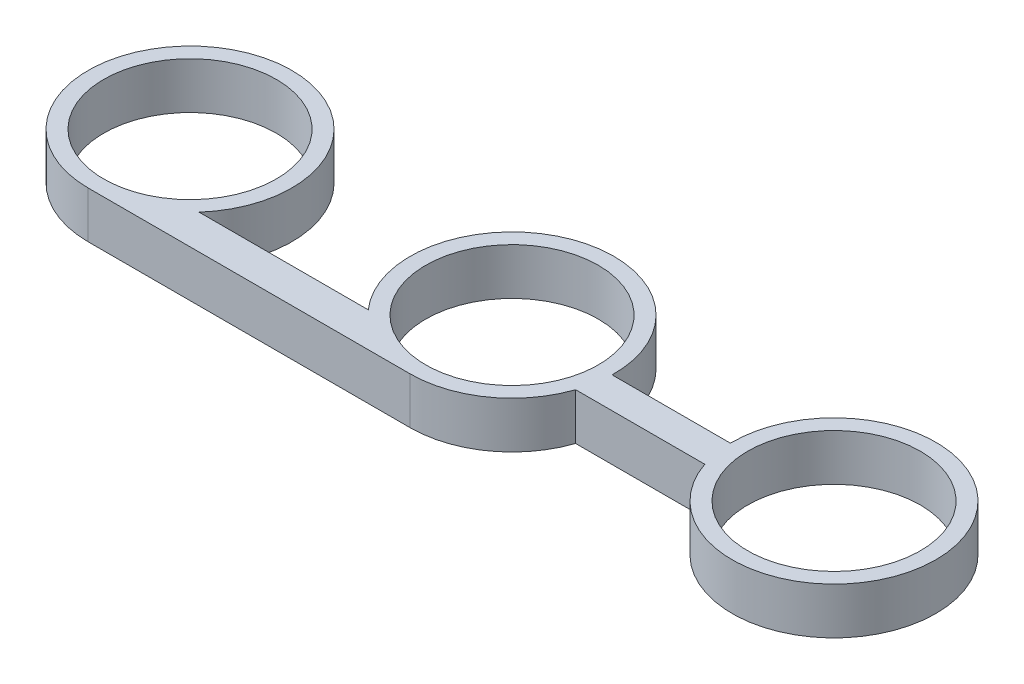
ISO-10303-21;
HEADER;
FILE_DESCRIPTION(('STEP AP214'),'2;1');
FILE_NAME('part.step','',(''),(''),'','','');
FILE_SCHEMA(('AUTOMOTIVE_DESIGN { 1 0 10303 214 1 1 1 1 }'));
ENDSEC;
DATA;
#1=APPLICATION_CONTEXT('core data for automotive mechanical design processes');
#2=APPLICATION_PROTOCOL_DEFINITION('international standard','automotive_design',2000,#1);
#3=PRODUCT_CONTEXT('',#1,'mechanical');
#4=PRODUCT('Part','Part','',(#3));
#5=PRODUCT_RELATED_PRODUCT_CATEGORY('part','',(#4));
#6=PRODUCT_DEFINITION_FORMATION('','',#4);
#7=PRODUCT_DEFINITION_CONTEXT('part definition',#1,'design');
#8=PRODUCT_DEFINITION('design','',#6,#7);
#9=PRODUCT_DEFINITION_SHAPE('','',#8);
#10=(LENGTH_UNIT() NAMED_UNIT(*) SI_UNIT(.MILLI.,.METRE.));
#11=(NAMED_UNIT(*) PLANE_ANGLE_UNIT() SI_UNIT($,.RADIAN.));
#12=(NAMED_UNIT(*) SI_UNIT($,.STERADIAN.) SOLID_ANGLE_UNIT());
#13=UNCERTAINTY_MEASURE_WITH_UNIT(LENGTH_MEASURE(1.E-05),#10,'distance_accuracy_value','');
#14=(GEOMETRIC_REPRESENTATION_CONTEXT(3) GLOBAL_UNCERTAINTY_ASSIGNED_CONTEXT((#13)) GLOBAL_UNIT_ASSIGNED_CONTEXT((#10,
#11,#12)) REPRESENTATION_CONTEXT('',''));
#15=CARTESIAN_POINT('',(0.,0.,0.));
#16=DIRECTION('',(0.,0.,1.));
#17=DIRECTION('',(1.,0.,0.));
#18=AXIS2_PLACEMENT_3D('',#15,#16,#17);
#19=CARTESIAN_POINT('',(-18.65,2.7,0.));
#20=DIRECTION('',(0.,1.,0.));
#21=DIRECTION('',(0.,0.,1.));
#22=AXIS2_PLACEMENT_3D('',#19,#20,#21);
#23=PLANE('',#22);
#24=CARTESIAN_POINT('',(18.65,2.7,0.));
#25=DIRECTION('',(0.,1.,0.));
#26=DIRECTION('',(0.,0.,1.));
#27=AXIS2_PLACEMENT_3D('',#24,#25,#26);
#28=CIRCLE('',#27,5.);
#29=CARTESIAN_POINT('',(18.65,2.7,-5.00000000000001));
#30=VERTEX_POINT('',#29);
#31=EDGE_CURVE('E213',#30,#30,#28,.T.);
#32=ORIENTED_EDGE('',*,*,#31,.F.);
#33=EDGE_LOOP('',(#32));
#34=FACE_BOUND('',#33,.T.);
#35=CARTESIAN_POINT('',(-18.65,2.7,0.));
#36=DIRECTION('',(0.,1.,0.));
#37=DIRECTION('',(0.,0.,1.));
#38=AXIS2_PLACEMENT_3D('',#35,#36,#37);
#39=CIRCLE('',#38,5.9);
#40=CARTESIAN_POINT('',(-14.2228112757643,2.7,3.9));
#41=VERTEX_POINT('',#40);
#42=CARTESIAN_POINT('',(-18.65,2.7,5.9));
#43=VERTEX_POINT('',#42);
#44=EDGE_CURVE('E164',#41,#43,#39,.T.);
#45=ORIENTED_EDGE('',*,*,#44,.T.);
#46=DIRECTION('',(1.,0.,0.));
#47=VECTOR('',#46,1.);
#48=CARTESIAN_POINT('',(-18.65,2.7,5.9));
#49=LINE('',#48,#47);
#50=CARTESIAN_POINT('',(0.,2.7,5.9));
#51=VERTEX_POINT('',#50);
#52=EDGE_CURVE('E100',#43,#51,#49,.T.);
#53=ORIENTED_EDGE('',*,*,#52,.T.);
#54=CARTESIAN_POINT('',(0.,2.7,0.));
#55=DIRECTION('',(0.,1.,0.));
#56=DIRECTION('',(0.,0.,1.));
#57=AXIS2_PLACEMENT_3D('',#54,#55,#56);
#58=CIRCLE('',#57,5.9);
#59=CARTESIAN_POINT('',(5.58569601750758,2.7,1.89999999999999));
#60=VERTEX_POINT('',#59);
#61=EDGE_CURVE('E185',#51,#60,#58,.T.);
#62=ORIENTED_EDGE('',*,*,#61,.T.);
#63=DIRECTION('',(1.,0.,0.));
#64=VECTOR('',#63,1.);
#65=CARTESIAN_POINT('',(5.58569601750758,2.7,1.89999999999999));
#66=LINE('',#65,#64);
#67=CARTESIAN_POINT('',(13.0643039824924,2.7,1.89999999999999));
#68=VERTEX_POINT('',#67);
#69=EDGE_CURVE('E199',#60,#68,#66,.T.);
#70=ORIENTED_EDGE('',*,*,#69,.T.);
#71=CARTESIAN_POINT('',(18.65,2.7,0.));
#72=DIRECTION('',(0.,1.,0.));
#73=DIRECTION('',(0.,0.,1.));
#74=AXIS2_PLACEMENT_3D('',#71,#72,#73);
#75=CIRCLE('',#74,5.9);
#76=CARTESIAN_POINT('',(12.7508475184989,2.7,0.0999999999999941));
#77=VERTEX_POINT('',#76);
#78=EDGE_CURVE('E119',#68,#77,#75,.T.);
#79=ORIENTED_EDGE('',*,*,#78,.T.);
#80=DIRECTION('',(-1.,0.,0.));
#81=VECTOR('',#80,1.);
#82=CARTESIAN_POINT('',(5.89915248150105,2.7,0.0999999999999938));
#83=LINE('',#82,#81);
#84=CARTESIAN_POINT('',(5.89915248150105,2.7,0.0999999999999938));
#85=VERTEX_POINT('',#84);
#86=EDGE_CURVE('E113',#77,#85,#83,.T.);
#87=ORIENTED_EDGE('',*,*,#86,.T.);
#88=CARTESIAN_POINT('',(0.,2.7,0.));
#89=DIRECTION('',(0.,1.,0.));
#90=DIRECTION('',(0.,0.,1.));
#91=AXIS2_PLACEMENT_3D('',#88,#89,#90);
#92=CIRCLE('',#91,5.9);
#93=CARTESIAN_POINT('',(-4.42718872423573,2.7,3.9));
#94=VERTEX_POINT('',#93);
#95=EDGE_CURVE('E117',#85,#94,#92,.T.);
#96=ORIENTED_EDGE('',*,*,#95,.T.);
#97=DIRECTION('',(-1.,0.,0.));
#98=VECTOR('',#97,1.);
#99=CARTESIAN_POINT('',(-14.2228112757643,2.7,3.9));
#100=LINE('',#99,#98);
#101=EDGE_CURVE('E57',#94,#41,#100,.T.);
#102=ORIENTED_EDGE('',*,*,#101,.T.);
#103=EDGE_LOOP('',(#45,#53,#62,#70,#79,#87,#96,#102));
#104=FACE_BOUND('',#103,.T.);
#105=CARTESIAN_POINT('',(0.,2.7,0.));
#106=DIRECTION('',(0.,1.,0.));
#107=DIRECTION('',(0.,0.,1.));
#108=AXIS2_PLACEMENT_3D('',#105,#106,#107);
#109=CIRCLE('',#108,5.);
#110=CARTESIAN_POINT('',(0.,2.7,-5.));
#111=VERTEX_POINT('',#110);
#112=EDGE_CURVE('E146',#111,#111,#109,.T.);
#113=ORIENTED_EDGE('',*,*,#112,.F.);
#114=EDGE_LOOP('',(#113));
#115=FACE_BOUND('',#114,.T.);
#116=CARTESIAN_POINT('',(-18.65,2.7,0.));
#117=DIRECTION('',(0.,1.,0.));
#118=DIRECTION('',(0.,0.,1.));
#119=AXIS2_PLACEMENT_3D('',#116,#117,#118);
#120=CIRCLE('',#119,5.);
#121=CARTESIAN_POINT('',(-18.65,2.7,-5.));
#122=VERTEX_POINT('',#121);
#123=EDGE_CURVE('E221',#122,#122,#120,.T.);
#124=ORIENTED_EDGE('',*,*,#123,.F.);
#125=EDGE_LOOP('',(#124));
#126=FACE_BOUND('',#125,.T.);
#127=ADVANCED_FACE('F39',(#34,#104,#115,#126),#23,.T.);
#128=CARTESIAN_POINT('',(-18.65,0.,0.));
#129=DIRECTION('',(0.,1.,0.));
#130=DIRECTION('',(0.,0.,1.));
#131=AXIS2_PLACEMENT_3D('',#128,#129,#130);
#132=PLANE('',#131);
#133=CARTESIAN_POINT('',(-18.65,0.,0.));
#134=DIRECTION('',(0.,1.,0.));
#135=DIRECTION('',(0.,0.,1.));
#136=AXIS2_PLACEMENT_3D('',#133,#134,#135);
#137=CIRCLE('',#136,5.9);
#138=CARTESIAN_POINT('',(-14.2228112757643,0.,3.9));
#139=VERTEX_POINT('',#138);
#140=CARTESIAN_POINT('',(-18.65,0.,5.9));
#141=VERTEX_POINT('',#140);
#142=EDGE_CURVE('E141',#139,#141,#137,.T.);
#143=ORIENTED_EDGE('',*,*,#142,.F.);
#144=DIRECTION('',(-1.,0.,0.));
#145=VECTOR('',#144,1.);
#146=CARTESIAN_POINT('',(-14.2228112757643,0.,3.9));
#147=LINE('',#146,#145);
#148=CARTESIAN_POINT('',(-4.42718872423573,0.,3.9));
#149=VERTEX_POINT('',#148);
#150=EDGE_CURVE('E92',#149,#139,#147,.T.);
#151=ORIENTED_EDGE('',*,*,#150,.F.);
#152=CARTESIAN_POINT('',(0.,0.,0.));
#153=DIRECTION('',(0.,1.,0.));
#154=DIRECTION('',(0.,0.,1.));
#155=AXIS2_PLACEMENT_3D('',#152,#153,#154);
#156=CIRCLE('',#155,5.9);
#157=CARTESIAN_POINT('',(5.89915248150105,0.,0.0999999999999938));
#158=VERTEX_POINT('',#157);
#159=EDGE_CURVE('E86',#158,#149,#156,.T.);
#160=ORIENTED_EDGE('',*,*,#159,.F.);
#161=DIRECTION('',(-1.,0.,0.));
#162=VECTOR('',#161,1.);
#163=CARTESIAN_POINT('',(5.89915248150105,0.,0.0999999999999938));
#164=LINE('',#163,#162);
#165=CARTESIAN_POINT('',(12.7508475184989,0.,0.0999999999999941));
#166=VERTEX_POINT('',#165);
#167=EDGE_CURVE('E128',#166,#158,#164,.T.);
#168=ORIENTED_EDGE('',*,*,#167,.F.);
#169=CARTESIAN_POINT('',(18.65,0.,0.));
#170=DIRECTION('',(0.,1.,0.));
#171=DIRECTION('',(0.,0.,1.));
#172=AXIS2_PLACEMENT_3D('',#169,#170,#171);
#173=CIRCLE('',#172,5.9);
#174=CARTESIAN_POINT('',(13.0643039824924,0.,1.89999999999999));
#175=VERTEX_POINT('',#174);
#176=EDGE_CURVE('E155',#175,#166,#173,.T.);
#177=ORIENTED_EDGE('',*,*,#176,.F.);
#178=DIRECTION('',(1.,0.,0.));
#179=VECTOR('',#178,1.);
#180=CARTESIAN_POINT('',(5.58569601750758,0.,1.89999999999999));
#181=LINE('',#180,#179);
#182=CARTESIAN_POINT('',(5.58569601750758,0.,1.89999999999999));
#183=VERTEX_POINT('',#182);
#184=EDGE_CURVE('E152',#183,#175,#181,.T.);
#185=ORIENTED_EDGE('',*,*,#184,.F.);
#186=CARTESIAN_POINT('',(0.,0.,0.));
#187=DIRECTION('',(0.,1.,0.));
#188=DIRECTION('',(0.,0.,1.));
#189=AXIS2_PLACEMENT_3D('',#186,#187,#188);
#190=CIRCLE('',#189,5.9);
#191=CARTESIAN_POINT('',(0.,0.,5.9));
#192=VERTEX_POINT('',#191);
#193=EDGE_CURVE('E149',#192,#183,#190,.T.);
#194=ORIENTED_EDGE('',*,*,#193,.F.);
#195=DIRECTION('',(1.,0.,0.));
#196=VECTOR('',#195,1.);
#197=CARTESIAN_POINT('',(-18.65,0.,5.9));
#198=LINE('',#197,#196);
#199=EDGE_CURVE('E145',#141,#192,#198,.T.);
#200=ORIENTED_EDGE('',*,*,#199,.F.);
#201=EDGE_LOOP('',(#143,#151,#160,#168,#177,#185,#194,#200));
#202=FACE_BOUND('',#201,.T.);
#203=CARTESIAN_POINT('',(0.,0.,0.));
#204=DIRECTION('',(0.,1.,0.));
#205=DIRECTION('',(0.,0.,1.));
#206=AXIS2_PLACEMENT_3D('',#203,#204,#205);
#207=CIRCLE('',#206,5.);
#208=CARTESIAN_POINT('',(0.,0.,-5.));
#209=VERTEX_POINT('',#208);
#210=EDGE_CURVE('E209',#209,#209,#207,.T.);
#211=ORIENTED_EDGE('',*,*,#210,.T.);
#212=EDGE_LOOP('',(#211));
#213=FACE_BOUND('',#212,.T.);
#214=CARTESIAN_POINT('',(18.65,0.,0.));
#215=DIRECTION('',(0.,1.,0.));
#216=DIRECTION('',(0.,0.,1.));
#217=AXIS2_PLACEMENT_3D('',#214,#215,#216);
#218=CIRCLE('',#217,5.);
#219=CARTESIAN_POINT('',(18.65,0.,-5.00000000000001));
#220=VERTEX_POINT('',#219);
#221=EDGE_CURVE('E217',#220,#220,#218,.T.);
#222=ORIENTED_EDGE('',*,*,#221,.T.);
#223=EDGE_LOOP('',(#222));
#224=FACE_BOUND('',#223,.T.);
#225=CARTESIAN_POINT('',(-18.65,0.,0.));
#226=DIRECTION('',(0.,1.,0.));
#227=DIRECTION('',(0.,0.,1.));
#228=AXIS2_PLACEMENT_3D('',#225,#226,#227);
#229=CIRCLE('',#228,5.);
#230=CARTESIAN_POINT('',(-18.65,0.,-5.));
#231=VERTEX_POINT('',#230);
#232=EDGE_CURVE('E225',#231,#231,#229,.T.);
#233=ORIENTED_EDGE('',*,*,#232,.T.);
#234=EDGE_LOOP('',(#233));
#235=FACE_BOUND('',#234,.T.);
#236=ADVANCED_FACE('F189',(#202,#213,#224,#235),#132,.F.);
#237=CARTESIAN_POINT('',(-18.65,2.7,0.));
#238=DIRECTION('',(0.,-1.,0.));
#239=DIRECTION('',(0.,0.,-1.));
#240=AXIS2_PLACEMENT_3D('',#237,#238,#239);
#241=CYLINDRICAL_SURFACE('',#240,5.9);
#242=ORIENTED_EDGE('',*,*,#142,.T.);
#243=DIRECTION('',(0.,-1.,0.));
#244=VECTOR('',#243,1.);
#245=CARTESIAN_POINT('',(-18.65,2.7,5.9));
#246=LINE('',#245,#244);
#247=EDGE_CURVE('E11',#43,#141,#246,.T.);
#248=ORIENTED_EDGE('',*,*,#247,.F.);
#249=ORIENTED_EDGE('',*,*,#44,.F.);
#250=DIRECTION('',(0.,-1.,0.));
#251=VECTOR('',#250,1.);
#252=CARTESIAN_POINT('',(-14.2228112757643,2.7,3.9));
#253=LINE('',#252,#251);
#254=EDGE_CURVE('E137',#41,#139,#253,.T.);
#255=ORIENTED_EDGE('',*,*,#254,.T.);
#256=EDGE_LOOP('',(#242,#248,#249,#255));
#257=FACE_BOUND('',#256,.T.);
#258=ADVANCED_FACE('F41',(#257),#241,.T.);
#259=CARTESIAN_POINT('',(-18.65,2.7,5.9));
#260=DIRECTION('',(0.,0.,-1.));
#261=DIRECTION('',(-1.,0.,0.));
#262=AXIS2_PLACEMENT_3D('',#259,#260,#261);
#263=PLANE('',#262);
#264=ORIENTED_EDGE('',*,*,#199,.T.);
#265=DIRECTION('',(0.,-1.,0.));
#266=VECTOR('',#265,1.);
#267=CARTESIAN_POINT('',(0.,2.7,5.9));
#268=LINE('',#267,#266);
#269=EDGE_CURVE('E49',#51,#192,#268,.T.);
#270=ORIENTED_EDGE('',*,*,#269,.F.);
#271=ORIENTED_EDGE('',*,*,#52,.F.);
#272=ORIENTED_EDGE('',*,*,#247,.T.);
#273=EDGE_LOOP('',(#264,#270,#271,#272));
#274=FACE_BOUND('',#273,.T.);
#275=ADVANCED_FACE('F260',(#274),#263,.F.);
#276=CARTESIAN_POINT('',(0.,2.7,0.));
#277=DIRECTION('',(0.,-1.,0.));
#278=DIRECTION('',(0.,0.,-1.));
#279=AXIS2_PLACEMENT_3D('',#276,#277,#278);
#280=CYLINDRICAL_SURFACE('',#279,5.9);
#281=ORIENTED_EDGE('',*,*,#193,.T.);
#282=DIRECTION('',(0.,-1.,0.));
#283=VECTOR('',#282,1.);
#284=CARTESIAN_POINT('',(5.58569601750758,2.7,1.89999999999999));
#285=LINE('',#284,#283);
#286=EDGE_CURVE('E175',#60,#183,#285,.T.);
#287=ORIENTED_EDGE('',*,*,#286,.F.);
#288=ORIENTED_EDGE('',*,*,#61,.F.);
#289=ORIENTED_EDGE('',*,*,#269,.T.);
#290=EDGE_LOOP('',(#281,#287,#288,#289));
#291=FACE_BOUND('',#290,.T.);
#292=ADVANCED_FACE('F183',(#291),#280,.T.);
#293=CARTESIAN_POINT('',(5.58569601750758,2.7,1.89999999999999));
#294=DIRECTION('',(0.,0.,-1.));
#295=DIRECTION('',(-1.,0.,0.));
#296=AXIS2_PLACEMENT_3D('',#293,#294,#295);
#297=PLANE('',#296);
#298=ORIENTED_EDGE('',*,*,#184,.T.);
#299=DIRECTION('',(0.,-1.,0.));
#300=VECTOR('',#299,1.);
#301=CARTESIAN_POINT('',(13.0643039824924,2.7,1.89999999999999));
#302=LINE('',#301,#300);
#303=EDGE_CURVE('E171',#68,#175,#302,.T.);
#304=ORIENTED_EDGE('',*,*,#303,.F.);
#305=ORIENTED_EDGE('',*,*,#69,.F.);
#306=ORIENTED_EDGE('',*,*,#286,.T.);
#307=EDGE_LOOP('',(#298,#304,#305,#306));
#308=FACE_BOUND('',#307,.T.);
#309=ADVANCED_FACE('F194',(#308),#297,.F.);
#310=CARTESIAN_POINT('',(18.65,2.7,0.));
#311=DIRECTION('',(0.,-1.,0.));
#312=DIRECTION('',(0.,0.,-1.));
#313=AXIS2_PLACEMENT_3D('',#310,#311,#312);
#314=CYLINDRICAL_SURFACE('',#313,5.9);
#315=ORIENTED_EDGE('',*,*,#176,.T.);
#316=DIRECTION('',(0.,-1.,0.));
#317=VECTOR('',#316,1.);
#318=CARTESIAN_POINT('',(12.7508475184989,2.7,0.0999999999999941));
#319=LINE('',#318,#317);
#320=EDGE_CURVE('E130',#77,#166,#319,.T.);
#321=ORIENTED_EDGE('',*,*,#320,.F.);
#322=ORIENTED_EDGE('',*,*,#78,.F.);
#323=ORIENTED_EDGE('',*,*,#303,.T.);
#324=EDGE_LOOP('',(#315,#321,#322,#323));
#325=FACE_BOUND('',#324,.T.);
#326=ADVANCED_FACE('F197',(#325),#314,.T.);
#327=CARTESIAN_POINT('',(5.89915248150105,2.7,0.0999999999999938));
#328=DIRECTION('',(0.,0.,1.));
#329=DIRECTION('',(1.,0.,0.));
#330=AXIS2_PLACEMENT_3D('',#327,#328,#329);
#331=PLANE('',#330);
#332=ORIENTED_EDGE('',*,*,#167,.T.);
#333=DIRECTION('',(0.,-1.,0.));
#334=VECTOR('',#333,1.);
#335=CARTESIAN_POINT('',(5.89915248150105,2.7,0.0999999999999938));
#336=LINE('',#335,#334);
#337=EDGE_CURVE('E125',#85,#158,#336,.T.);
#338=ORIENTED_EDGE('',*,*,#337,.F.);
#339=ORIENTED_EDGE('',*,*,#86,.F.);
#340=ORIENTED_EDGE('',*,*,#320,.T.);
#341=EDGE_LOOP('',(#332,#338,#339,#340));
#342=FACE_BOUND('',#341,.T.);
#343=ADVANCED_FACE('F126',(#342),#331,.F.);
#344=CARTESIAN_POINT('',(0.,2.7,0.));
#345=DIRECTION('',(0.,-1.,0.));
#346=DIRECTION('',(0.,0.,-1.));
#347=AXIS2_PLACEMENT_3D('',#344,#345,#346);
#348=CYLINDRICAL_SURFACE('',#347,5.9);
#349=ORIENTED_EDGE('',*,*,#159,.T.);
#350=DIRECTION('',(0.,-1.,0.));
#351=VECTOR('',#350,1.);
#352=CARTESIAN_POINT('',(-4.42718872423573,2.7,3.9));
#353=LINE('',#352,#351);
#354=EDGE_CURVE('E131',#94,#149,#353,.T.);
#355=ORIENTED_EDGE('',*,*,#354,.F.);
#356=ORIENTED_EDGE('',*,*,#95,.F.);
#357=ORIENTED_EDGE('',*,*,#337,.T.);
#358=EDGE_LOOP('',(#349,#355,#356,#357));
#359=FACE_BOUND('',#358,.T.);
#360=ADVANCED_FACE('F133',(#359),#348,.T.);
#361=CARTESIAN_POINT('',(-14.2228112757643,2.7,3.9));
#362=DIRECTION('',(0.,0.,1.));
#363=DIRECTION('',(1.,0.,0.));
#364=AXIS2_PLACEMENT_3D('',#361,#362,#363);
#365=PLANE('',#364);
#366=ORIENTED_EDGE('',*,*,#150,.T.);
#367=ORIENTED_EDGE('',*,*,#254,.F.);
#368=ORIENTED_EDGE('',*,*,#101,.F.);
#369=ORIENTED_EDGE('',*,*,#354,.T.);
#370=EDGE_LOOP('',(#366,#367,#368,#369));
#371=FACE_BOUND('',#370,.T.);
#372=ADVANCED_FACE('F248',(#371),#365,.F.);
#373=CARTESIAN_POINT('',(0.,2.7,0.));
#374=DIRECTION('',(0.,-1.,0.));
#375=DIRECTION('',(0.,0.,-1.));
#376=AXIS2_PLACEMENT_3D('',#373,#374,#375);
#377=CYLINDRICAL_SURFACE('',#376,5.);
#378=CARTESIAN_POINT('',(0.,2.7,-5.));
#379=CARTESIAN_POINT('',(0.,2.671875,-5.));
#380=CARTESIAN_POINT('',(0.,2.64375,-5.));
#381=CARTESIAN_POINT('',(0.,2.5875,-5.));
#382=CARTESIAN_POINT('',(0.,2.559375,-5.));
#383=CARTESIAN_POINT('',(0.,2.503125,-5.));
#384=CARTESIAN_POINT('',(0.,2.475,-5.));
#385=CARTESIAN_POINT('',(0.,2.41875,-5.));
#386=CARTESIAN_POINT('',(0.,2.390625,-5.));
#387=CARTESIAN_POINT('',(0.,2.334375,-5.));
#388=CARTESIAN_POINT('',(0.,2.30625,-5.));
#389=CARTESIAN_POINT('',(0.,2.25,-5.));
#390=CARTESIAN_POINT('',(0.,2.221875,-5.));
#391=CARTESIAN_POINT('',(0.,2.165625,-5.));
#392=CARTESIAN_POINT('',(0.,2.1375,-5.));
#393=CARTESIAN_POINT('',(0.,2.08125,-5.));
#394=CARTESIAN_POINT('',(0.,2.053125,-5.));
#395=CARTESIAN_POINT('',(0.,1.996875,-5.));
#396=CARTESIAN_POINT('',(0.,1.96875,-5.));
#397=CARTESIAN_POINT('',(0.,1.9125,-5.));
#398=CARTESIAN_POINT('',(0.,1.884375,-5.));
#399=CARTESIAN_POINT('',(0.,1.828125,-5.));
#400=CARTESIAN_POINT('',(0.,1.8,-5.));
#401=CARTESIAN_POINT('',(0.,1.74375,-5.));
#402=CARTESIAN_POINT('',(0.,1.715625,-5.));
#403=CARTESIAN_POINT('',(0.,1.659375,-5.));
#404=CARTESIAN_POINT('',(0.,1.63125,-5.));
#405=CARTESIAN_POINT('',(0.,1.575,-5.));
#406=CARTESIAN_POINT('',(0.,1.546875,-5.));
#407=CARTESIAN_POINT('',(0.,1.490625,-5.));
#408=CARTESIAN_POINT('',(0.,1.4625,-5.));
#409=CARTESIAN_POINT('',(0.,1.40625,-5.));
#410=CARTESIAN_POINT('',(0.,1.378125,-5.));
#411=CARTESIAN_POINT('',(0.,1.321875,-5.));
#412=CARTESIAN_POINT('',(0.,1.29375,-5.));
#413=CARTESIAN_POINT('',(0.,1.2375,-5.));
#414=CARTESIAN_POINT('',(0.,1.209375,-5.));
#415=CARTESIAN_POINT('',(0.,1.153125,-5.));
#416=CARTESIAN_POINT('',(0.,1.125,-5.));
#417=CARTESIAN_POINT('',(0.,1.06875,-5.));
#418=CARTESIAN_POINT('',(0.,1.040625,-5.));
#419=CARTESIAN_POINT('',(0.,0.984375,-5.));
#420=CARTESIAN_POINT('',(0.,0.95625,-5.));
#421=CARTESIAN_POINT('',(0.,0.9,-5.));
#422=CARTESIAN_POINT('',(0.,0.871875,-5.));
#423=CARTESIAN_POINT('',(0.,0.815625,-5.));
#424=CARTESIAN_POINT('',(0.,0.7875,-5.));
#425=CARTESIAN_POINT('',(0.,0.73125,-5.));
#426=CARTESIAN_POINT('',(0.,0.703125,-5.));
#427=CARTESIAN_POINT('',(0.,0.646875,-5.));
#428=CARTESIAN_POINT('',(0.,0.61875,-5.));
#429=CARTESIAN_POINT('',(0.,0.5625,-5.));
#430=CARTESIAN_POINT('',(0.,0.534375,-5.));
#431=CARTESIAN_POINT('',(0.,0.478125,-5.));
#432=CARTESIAN_POINT('',(0.,0.45,-5.));
#433=CARTESIAN_POINT('',(0.,0.39375,-5.));
#434=CARTESIAN_POINT('',(0.,0.365625,-5.));
#435=CARTESIAN_POINT('',(0.,0.309375,-5.));
#436=CARTESIAN_POINT('',(0.,0.28125,-5.));
#437=CARTESIAN_POINT('',(0.,0.225,-5.));
#438=CARTESIAN_POINT('',(0.,0.196875,-5.));
#439=CARTESIAN_POINT('',(0.,0.140625,-5.));
#440=CARTESIAN_POINT('',(0.,0.112499999999999,-5.));
#441=CARTESIAN_POINT('',(0.,0.0562499999999994,-5.));
#442=CARTESIAN_POINT('',(0.,0.0281249999999995,-5.));
#443=CARTESIAN_POINT('',(0.,0.,-5.));
#444=B_SPLINE_CURVE_WITH_KNOTS('',3,(#378,#379,#380,#381,#382,#383,#384,#385,#386,#387,#388,
#389,#390,#391,#392,#393,#394,#395,#396,#397,#398,#399,#400,#401,#402,#403,#404,#405,#406,#407,
#408,#409,#410,#411,#412,#413,#414,#415,#416,#417,#418,#419,#420,#421,#422,#423,#424,#425,#426,
#427,#428,#429,#430,#431,#432,#433,#434,#435,#436,#437,#438,#439,#440,#441,#442,#443),
.UNSPECIFIED.,.F.,.F.,(4,2,2,2,2,2,2,2,2,2,2,2,2,2,2,2,2,2,2,2,2,2,2,2,2,2,2,2,2,2,2,2,4),(0.,
0.0843749999999998,0.16875,0.253125,0.3375,0.421875,0.50625,0.590625,0.675,0.759375,0.84375,
0.928125,1.0125,1.096875,1.18125,1.265625,1.35,1.434375,1.51875,1.603125,1.6875,1.771875,
1.85625,1.940625,2.025,2.109375,2.19375,2.278125,2.3625,2.446875,2.53125,2.615625,2.7),.UNSPECIFIED.);
#445=EDGE_CURVE('BSEAM245',#111,#209,#444,.T.);
#446=ORIENTED_EDGE('',*,*,#112,.T.);
#447=ORIENTED_EDGE('',*,*,#210,.F.);
#448=ORIENTED_EDGE('',*,*,#445,.T.);
#449=ORIENTED_EDGE('',*,*,#445,.F.);
#450=EDGE_LOOP('',(#446,#448,#447,#449));
#451=FACE_BOUND('',#450,.T.);
#452=ADVANCED_FACE('F245',(#451),#377,.F.);
#453=CARTESIAN_POINT('',(18.65,2.7,0.));
#454=DIRECTION('',(0.,-1.,0.));
#455=DIRECTION('',(0.,0.,-1.));
#456=AXIS2_PLACEMENT_3D('',#453,#454,#455);
#457=CYLINDRICAL_SURFACE('',#456,5.);
#458=CARTESIAN_POINT('',(18.65,2.7,-5.00000000000001));
#459=CARTESIAN_POINT('',(18.65,2.671875,-5.00000000000001));
#460=CARTESIAN_POINT('',(18.65,2.64375,-5.00000000000001));
#461=CARTESIAN_POINT('',(18.65,2.5875,-5.00000000000001));
#462=CARTESIAN_POINT('',(18.65,2.559375,-5.00000000000001));
#463=CARTESIAN_POINT('',(18.65,2.503125,-5.00000000000001));
#464=CARTESIAN_POINT('',(18.65,2.475,-5.00000000000001));
#465=CARTESIAN_POINT('',(18.65,2.41875,-5.00000000000001));
#466=CARTESIAN_POINT('',(18.65,2.390625,-5.00000000000001));
#467=CARTESIAN_POINT('',(18.65,2.334375,-5.00000000000001));
#468=CARTESIAN_POINT('',(18.65,2.30625,-5.00000000000001));
#469=CARTESIAN_POINT('',(18.65,2.25,-5.00000000000001));
#470=CARTESIAN_POINT('',(18.65,2.221875,-5.00000000000001));
#471=CARTESIAN_POINT('',(18.65,2.165625,-5.00000000000001));
#472=CARTESIAN_POINT('',(18.65,2.1375,-5.00000000000001));
#473=CARTESIAN_POINT('',(18.65,2.08125,-5.00000000000001));
#474=CARTESIAN_POINT('',(18.65,2.053125,-5.00000000000001));
#475=CARTESIAN_POINT('',(18.65,1.996875,-5.00000000000001));
#476=CARTESIAN_POINT('',(18.65,1.96875,-5.00000000000001));
#477=CARTESIAN_POINT('',(18.65,1.9125,-5.00000000000001));
#478=CARTESIAN_POINT('',(18.65,1.884375,-5.00000000000001));
#479=CARTESIAN_POINT('',(18.65,1.828125,-5.00000000000001));
#480=CARTESIAN_POINT('',(18.65,1.8,-5.00000000000001));
#481=CARTESIAN_POINT('',(18.65,1.74375,-5.00000000000001));
#482=CARTESIAN_POINT('',(18.65,1.715625,-5.00000000000001));
#483=CARTESIAN_POINT('',(18.65,1.659375,-5.00000000000001));
#484=CARTESIAN_POINT('',(18.65,1.63125,-5.00000000000001));
#485=CARTESIAN_POINT('',(18.65,1.575,-5.00000000000001));
#486=CARTESIAN_POINT('',(18.65,1.546875,-5.00000000000001));
#487=CARTESIAN_POINT('',(18.65,1.490625,-5.00000000000001));
#488=CARTESIAN_POINT('',(18.65,1.4625,-5.00000000000001));
#489=CARTESIAN_POINT('',(18.65,1.40625,-5.00000000000001));
#490=CARTESIAN_POINT('',(18.65,1.378125,-5.00000000000001));
#491=CARTESIAN_POINT('',(18.65,1.321875,-5.00000000000001));
#492=CARTESIAN_POINT('',(18.65,1.29375,-5.00000000000001));
#493=CARTESIAN_POINT('',(18.65,1.2375,-5.00000000000001));
#494=CARTESIAN_POINT('',(18.65,1.209375,-5.00000000000001));
#495=CARTESIAN_POINT('',(18.65,1.153125,-5.00000000000001));
#496=CARTESIAN_POINT('',(18.65,1.125,-5.00000000000001));
#497=CARTESIAN_POINT('',(18.65,1.06875,-5.00000000000001));
#498=CARTESIAN_POINT('',(18.65,1.040625,-5.00000000000001));
#499=CARTESIAN_POINT('',(18.65,0.984375,-5.00000000000001));
#500=CARTESIAN_POINT('',(18.65,0.95625,-5.00000000000001));
#501=CARTESIAN_POINT('',(18.65,0.9,-5.00000000000001));
#502=CARTESIAN_POINT('',(18.65,0.871875,-5.00000000000001));
#503=CARTESIAN_POINT('',(18.65,0.815625,-5.00000000000001));
#504=CARTESIAN_POINT('',(18.65,0.7875,-5.00000000000001));
#505=CARTESIAN_POINT('',(18.65,0.73125,-5.00000000000001));
#506=CARTESIAN_POINT('',(18.65,0.703125,-5.00000000000001));
#507=CARTESIAN_POINT('',(18.65,0.646875,-5.00000000000001));
#508=CARTESIAN_POINT('',(18.65,0.61875,-5.00000000000001));
#509=CARTESIAN_POINT('',(18.65,0.5625,-5.00000000000001));
#510=CARTESIAN_POINT('',(18.65,0.534375,-5.00000000000001));
#511=CARTESIAN_POINT('',(18.65,0.478125,-5.00000000000001));
#512=CARTESIAN_POINT('',(18.65,0.45,-5.00000000000001));
#513=CARTESIAN_POINT('',(18.65,0.39375,-5.00000000000001));
#514=CARTESIAN_POINT('',(18.65,0.365625,-5.00000000000001));
#515=CARTESIAN_POINT('',(18.65,0.309375,-5.00000000000001));
#516=CARTESIAN_POINT('',(18.65,0.28125,-5.00000000000001));
#517=CARTESIAN_POINT('',(18.65,0.225,-5.00000000000001));
#518=CARTESIAN_POINT('',(18.65,0.196875,-5.00000000000001));
#519=CARTESIAN_POINT('',(18.65,0.140625,-5.00000000000001));
#520=CARTESIAN_POINT('',(18.65,0.112499999999999,-5.00000000000001));
#521=CARTESIAN_POINT('',(18.65,0.0562499999999994,-5.00000000000001));
#522=CARTESIAN_POINT('',(18.65,0.0281249999999995,-5.00000000000001));
#523=CARTESIAN_POINT('',(18.65,0.,-5.00000000000001));
#524=B_SPLINE_CURVE_WITH_KNOTS('',3,(#458,#459,#460,#461,#462,#463,#464,#465,#466,#467,#468,
#469,#470,#471,#472,#473,#474,#475,#476,#477,#478,#479,#480,#481,#482,#483,#484,#485,#486,#487,
#488,#489,#490,#491,#492,#493,#494,#495,#496,#497,#498,#499,#500,#501,#502,#503,#504,#505,#506,
#507,#508,#509,#510,#511,#512,#513,#514,#515,#516,#517,#518,#519,#520,#521,#522,#523),
.UNSPECIFIED.,.F.,.F.,(4,2,2,2,2,2,2,2,2,2,2,2,2,2,2,2,2,2,2,2,2,2,2,2,2,2,2,2,2,2,2,2,4),(0.,
0.0843749999999998,0.16875,0.253125,0.3375,0.421875,0.50625,0.590625,0.675,0.759375,0.84375,
0.928125,1.0125,1.096875,1.18125,1.265625,1.35,1.434375,1.51875,1.603125,1.6875,1.771875,
1.85625,1.940625,2.025,2.109375,2.19375,2.278125,2.3625,2.446875,2.53125,2.615625,2.7),.UNSPECIFIED.);
#525=EDGE_CURVE('BSEAM324',#30,#220,#524,.T.);
#526=ORIENTED_EDGE('',*,*,#31,.T.);
#527=ORIENTED_EDGE('',*,*,#221,.F.);
#528=ORIENTED_EDGE('',*,*,#525,.T.);
#529=ORIENTED_EDGE('',*,*,#525,.F.);
#530=EDGE_LOOP('',(#526,#528,#527,#529));
#531=FACE_BOUND('',#530,.T.);
#532=ADVANCED_FACE('F324',(#531),#457,.F.);
#533=CARTESIAN_POINT('',(-18.65,2.7,0.));
#534=DIRECTION('',(0.,-1.,0.));
#535=DIRECTION('',(0.,0.,-1.));
#536=AXIS2_PLACEMENT_3D('',#533,#534,#535);
#537=CYLINDRICAL_SURFACE('',#536,5.);
#538=CARTESIAN_POINT('',(-18.65,2.7,-5.));
#539=CARTESIAN_POINT('',(-18.65,2.671875,-5.));
#540=CARTESIAN_POINT('',(-18.65,2.64375,-5.));
#541=CARTESIAN_POINT('',(-18.65,2.5875,-5.));
#542=CARTESIAN_POINT('',(-18.65,2.559375,-5.));
#543=CARTESIAN_POINT('',(-18.65,2.503125,-5.));
#544=CARTESIAN_POINT('',(-18.65,2.475,-5.));
#545=CARTESIAN_POINT('',(-18.65,2.41875,-5.));
#546=CARTESIAN_POINT('',(-18.65,2.390625,-5.));
#547=CARTESIAN_POINT('',(-18.65,2.334375,-5.));
#548=CARTESIAN_POINT('',(-18.65,2.30625,-5.));
#549=CARTESIAN_POINT('',(-18.65,2.25,-5.));
#550=CARTESIAN_POINT('',(-18.65,2.221875,-5.));
#551=CARTESIAN_POINT('',(-18.65,2.165625,-5.));
#552=CARTESIAN_POINT('',(-18.65,2.1375,-5.));
#553=CARTESIAN_POINT('',(-18.65,2.08125,-5.));
#554=CARTESIAN_POINT('',(-18.65,2.053125,-5.));
#555=CARTESIAN_POINT('',(-18.65,1.996875,-5.));
#556=CARTESIAN_POINT('',(-18.65,1.96875,-5.));
#557=CARTESIAN_POINT('',(-18.65,1.9125,-5.));
#558=CARTESIAN_POINT('',(-18.65,1.884375,-5.));
#559=CARTESIAN_POINT('',(-18.65,1.828125,-5.));
#560=CARTESIAN_POINT('',(-18.65,1.8,-5.));
#561=CARTESIAN_POINT('',(-18.65,1.74375,-5.));
#562=CARTESIAN_POINT('',(-18.65,1.715625,-5.));
#563=CARTESIAN_POINT('',(-18.65,1.659375,-5.));
#564=CARTESIAN_POINT('',(-18.65,1.63125,-5.));
#565=CARTESIAN_POINT('',(-18.65,1.575,-5.));
#566=CARTESIAN_POINT('',(-18.65,1.546875,-5.));
#567=CARTESIAN_POINT('',(-18.65,1.490625,-5.));
#568=CARTESIAN_POINT('',(-18.65,1.4625,-5.));
#569=CARTESIAN_POINT('',(-18.65,1.40625,-5.));
#570=CARTESIAN_POINT('',(-18.65,1.378125,-5.));
#571=CARTESIAN_POINT('',(-18.65,1.321875,-5.));
#572=CARTESIAN_POINT('',(-18.65,1.29375,-5.));
#573=CARTESIAN_POINT('',(-18.65,1.2375,-5.));
#574=CARTESIAN_POINT('',(-18.65,1.209375,-5.));
#575=CARTESIAN_POINT('',(-18.65,1.153125,-5.));
#576=CARTESIAN_POINT('',(-18.65,1.125,-5.));
#577=CARTESIAN_POINT('',(-18.65,1.06875,-5.));
#578=CARTESIAN_POINT('',(-18.65,1.040625,-5.));
#579=CARTESIAN_POINT('',(-18.65,0.984375,-5.));
#580=CARTESIAN_POINT('',(-18.65,0.95625,-5.));
#581=CARTESIAN_POINT('',(-18.65,0.9,-5.));
#582=CARTESIAN_POINT('',(-18.65,0.871875,-5.));
#583=CARTESIAN_POINT('',(-18.65,0.815625,-5.));
#584=CARTESIAN_POINT('',(-18.65,0.7875,-5.));
#585=CARTESIAN_POINT('',(-18.65,0.73125,-5.));
#586=CARTESIAN_POINT('',(-18.65,0.703125,-5.));
#587=CARTESIAN_POINT('',(-18.65,0.646875,-5.));
#588=CARTESIAN_POINT('',(-18.65,0.61875,-5.));
#589=CARTESIAN_POINT('',(-18.65,0.5625,-5.));
#590=CARTESIAN_POINT('',(-18.65,0.534375,-5.));
#591=CARTESIAN_POINT('',(-18.65,0.478125,-5.));
#592=CARTESIAN_POINT('',(-18.65,0.45,-5.));
#593=CARTESIAN_POINT('',(-18.65,0.39375,-5.));
#594=CARTESIAN_POINT('',(-18.65,0.365625,-5.));
#595=CARTESIAN_POINT('',(-18.65,0.309375,-5.));
#596=CARTESIAN_POINT('',(-18.65,0.28125,-5.));
#597=CARTESIAN_POINT('',(-18.65,0.225,-5.));
#598=CARTESIAN_POINT('',(-18.65,0.196875,-5.));
#599=CARTESIAN_POINT('',(-18.65,0.140625,-5.));
#600=CARTESIAN_POINT('',(-18.65,0.112499999999999,-5.));
#601=CARTESIAN_POINT('',(-18.65,0.0562499999999994,-5.));
#602=CARTESIAN_POINT('',(-18.65,0.0281249999999995,-5.));
#603=CARTESIAN_POINT('',(-18.65,0.,-5.));
#604=B_SPLINE_CURVE_WITH_KNOTS('',3,(#538,#539,#540,#541,#542,#543,#544,#545,#546,#547,#548,
#549,#550,#551,#552,#553,#554,#555,#556,#557,#558,#559,#560,#561,#562,#563,#564,#565,#566,#567,
#568,#569,#570,#571,#572,#573,#574,#575,#576,#577,#578,#579,#580,#581,#582,#583,#584,#585,#586,
#587,#588,#589,#590,#591,#592,#593,#594,#595,#596,#597,#598,#599,#600,#601,#602,#603),
.UNSPECIFIED.,.F.,.F.,(4,2,2,2,2,2,2,2,2,2,2,2,2,2,2,2,2,2,2,2,2,2,2,2,2,2,2,2,2,2,2,2,4),(0.,
0.0843749999999998,0.16875,0.253125,0.3375,0.421875,0.50625,0.590625,0.675,0.759375,0.84375,
0.928125,1.0125,1.096875,1.18125,1.265625,1.35,1.434375,1.51875,1.603125,1.6875,1.771875,
1.85625,1.940625,2.025,2.109375,2.19375,2.278125,2.3625,2.446875,2.53125,2.615625,2.7),.UNSPECIFIED.);
#605=EDGE_CURVE('BSEAM233',#122,#231,#604,.T.);
#606=ORIENTED_EDGE('',*,*,#123,.T.);
#607=ORIENTED_EDGE('',*,*,#232,.F.);
#608=ORIENTED_EDGE('',*,*,#605,.T.);
#609=ORIENTED_EDGE('',*,*,#605,.F.);
#610=EDGE_LOOP('',(#606,#608,#607,#609));
#611=FACE_BOUND('',#610,.T.);
#612=ADVANCED_FACE('F233',(#611),#537,.F.);
#613=CLOSED_SHELL('',(#127,#236,#258,#275,#292,#309,#326,#343,#360,#372,#452,#532,#612));
#614=MANIFOLD_SOLID_BREP('B2',#613);
#615=ADVANCED_BREP_SHAPE_REPRESENTATION('',(#18,#614),#14);
#616=SHAPE_DEFINITION_REPRESENTATION(#9,#615);
ENDSEC;
END-ISO-10303-21;
